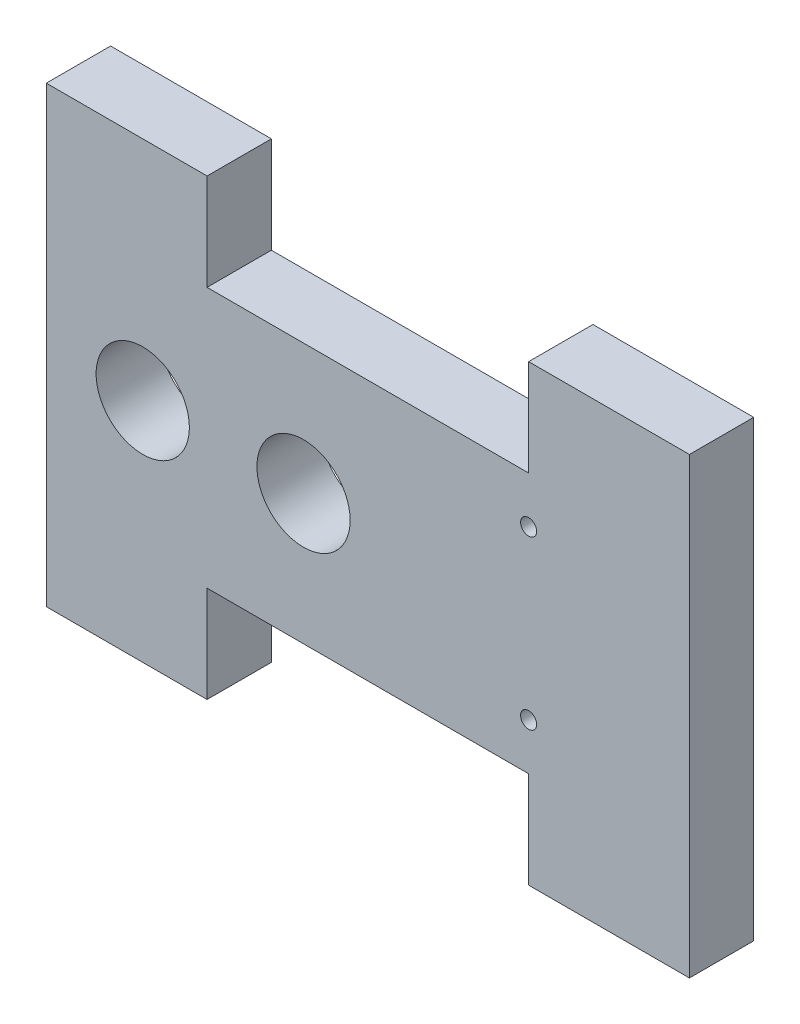
ISO-10303-21;
HEADER;
FILE_DESCRIPTION(('STEP AP214'),'2;1');
FILE_NAME('part.step','',(''),(''),'','','');
FILE_SCHEMA(('AUTOMOTIVE_DESIGN { 1 0 10303 214 1 1 1 1 }'));
ENDSEC;
DATA;
#1=APPLICATION_CONTEXT('core data for automotive mechanical design processes');
#2=APPLICATION_PROTOCOL_DEFINITION('international standard','automotive_design',2000,#1);
#3=PRODUCT_CONTEXT('',#1,'mechanical');
#4=PRODUCT('Part','Part','',(#3));
#5=PRODUCT_RELATED_PRODUCT_CATEGORY('part','',(#4));
#6=PRODUCT_DEFINITION_FORMATION('','',#4);
#7=PRODUCT_DEFINITION_CONTEXT('part definition',#1,'design');
#8=PRODUCT_DEFINITION('design','',#6,#7);
#9=PRODUCT_DEFINITION_SHAPE('','',#8);
#10=(LENGTH_UNIT() NAMED_UNIT(*) SI_UNIT(.MILLI.,.METRE.));
#11=(NAMED_UNIT(*) PLANE_ANGLE_UNIT() SI_UNIT($,.RADIAN.));
#12=(NAMED_UNIT(*) SI_UNIT($,.STERADIAN.) SOLID_ANGLE_UNIT());
#13=UNCERTAINTY_MEASURE_WITH_UNIT(LENGTH_MEASURE(1.E-05),#10,'distance_accuracy_value','');
#14=(GEOMETRIC_REPRESENTATION_CONTEXT(3) GLOBAL_UNCERTAINTY_ASSIGNED_CONTEXT((#13)) GLOBAL_UNIT_ASSIGNED_CONTEXT((#10,
#11,#12)) REPRESENTATION_CONTEXT('',''));
#15=CARTESIAN_POINT('',(0.,0.,0.));
#16=DIRECTION('',(0.,0.,1.));
#17=DIRECTION('',(1.,0.,0.));
#18=AXIS2_PLACEMENT_3D('',#15,#16,#17);
#19=CARTESIAN_POINT('',(-93.3490832191863,6.09260289357956,1.7));
#20=DIRECTION('',(-1.,0.,0.));
#21=DIRECTION('',(0.,0.,1.));
#22=AXIS2_PLACEMENT_3D('',#19,#20,#21);
#23=PLANE('',#22);
#24=DIRECTION('',(0.,0.,-1.));
#25=VECTOR('',#24,1.);
#26=CARTESIAN_POINT('',(-93.3490832191863,6.09260289357956,1.7));
#27=LINE('',#26,#25);
#28=CARTESIAN_POINT('',(-93.3490832191863,6.09260289357956,1.7));
#29=VERTEX_POINT('',#28);
#30=CARTESIAN_POINT('',(-93.3490832191863,6.09260289357956,-0.3));
#31=VERTEX_POINT('',#30);
#32=EDGE_CURVE('E141',#29,#31,#27,.T.);
#33=ORIENTED_EDGE('',*,*,#32,.T.);
#34=DIRECTION('',(0.,1.,0.));
#35=VECTOR('',#34,1.);
#36=CARTESIAN_POINT('',(-93.3490832191863,6.09260289357956,-0.3));
#37=LINE('',#36,#35);
#38=CARTESIAN_POINT('',(-93.3490832191863,9.09260289357956,-0.3));
#39=VERTEX_POINT('',#38);
#40=EDGE_CURVE('E135',#31,#39,#37,.T.);
#41=ORIENTED_EDGE('',*,*,#40,.T.);
#42=DIRECTION('',(0.,0.,-1.));
#43=VECTOR('',#42,1.);
#44=CARTESIAN_POINT('',(-93.3490832191863,9.09260289357956,1.7));
#45=LINE('',#44,#43);
#46=CARTESIAN_POINT('',(-93.3490832191863,9.09260289357956,1.7));
#47=VERTEX_POINT('',#46);
#48=EDGE_CURVE('E11',#47,#39,#45,.T.);
#49=ORIENTED_EDGE('',*,*,#48,.F.);
#50=DIRECTION('',(0.,1.,0.));
#51=VECTOR('',#50,1.);
#52=CARTESIAN_POINT('',(-93.3490832191863,6.09260289357956,1.7));
#53=LINE('',#52,#51);
#54=EDGE_CURVE('E176',#29,#47,#53,.T.);
#55=ORIENTED_EDGE('',*,*,#54,.F.);
#56=EDGE_LOOP('',(#33,#41,#49,#55));
#57=FACE_BOUND('',#56,.T.);
#58=ADVANCED_FACE('F35',(#57),#23,.F.);
#59=CARTESIAN_POINT('',(-93.3490832191863,9.09260289357956,1.7));
#60=DIRECTION('',(0.,1.,0.));
#61=DIRECTION('',(0.,0.,1.));
#62=AXIS2_PLACEMENT_3D('',#59,#60,#61);
#63=PLANE('',#62);
#64=ORIENTED_EDGE('',*,*,#48,.T.);
#65=DIRECTION('',(1.,0.,0.));
#66=VECTOR('',#65,1.);
#67=CARTESIAN_POINT('',(-93.3490832191863,9.09260289357956,-0.3));
#68=LINE('',#67,#66);
#69=CARTESIAN_POINT('',(-83.3490832191863,9.09260289357956,-0.3));
#70=VERTEX_POINT('',#69);
#71=EDGE_CURVE('E125',#39,#70,#68,.T.);
#72=ORIENTED_EDGE('',*,*,#71,.T.);
#73=DIRECTION('',(0.,0.,-1.));
#74=VECTOR('',#73,1.);
#75=CARTESIAN_POINT('',(-83.3490832191863,9.09260289357956,1.7));
#76=LINE('',#75,#74);
#77=CARTESIAN_POINT('',(-83.3490832191863,9.09260289357956,1.7));
#78=VERTEX_POINT('',#77);
#79=EDGE_CURVE('E42',#78,#70,#76,.T.);
#80=ORIENTED_EDGE('',*,*,#79,.F.);
#81=DIRECTION('',(1.,0.,0.));
#82=VECTOR('',#81,1.);
#83=CARTESIAN_POINT('',(-93.3490832191863,9.09260289357956,1.7));
#84=LINE('',#83,#82);
#85=EDGE_CURVE('E126',#47,#78,#84,.T.);
#86=ORIENTED_EDGE('',*,*,#85,.F.);
#87=EDGE_LOOP('',(#64,#72,#80,#86));
#88=FACE_BOUND('',#87,.T.);
#89=ADVANCED_FACE('F123',(#88),#63,.F.);
#90=CARTESIAN_POINT('',(-83.3490832191863,6.09260289357956,1.7));
#91=DIRECTION('',(1.,0.,0.));
#92=DIRECTION('',(0.,0.,-1.));
#93=AXIS2_PLACEMENT_3D('',#90,#91,#92);
#94=PLANE('',#93);
#95=ORIENTED_EDGE('',*,*,#79,.T.);
#96=DIRECTION('',(0.,-1.,0.));
#97=VECTOR('',#96,1.);
#98=CARTESIAN_POINT('',(-83.3490832191863,6.09260289357956,-0.3));
#99=LINE('',#98,#97);
#100=CARTESIAN_POINT('',(-83.3490832191863,6.09260289357956,-0.3));
#101=VERTEX_POINT('',#100);
#102=EDGE_CURVE('E139',#70,#101,#99,.T.);
#103=ORIENTED_EDGE('',*,*,#102,.T.);
#104=DIRECTION('',(0.,0.,-1.));
#105=VECTOR('',#104,1.);
#106=CARTESIAN_POINT('',(-83.3490832191863,6.09260289357956,1.7));
#107=LINE('',#106,#105);
#108=CARTESIAN_POINT('',(-83.3490832191863,6.09260289357956,1.7));
#109=VERTEX_POINT('',#108);
#110=EDGE_CURVE('E214',#109,#101,#107,.T.);
#111=ORIENTED_EDGE('',*,*,#110,.F.);
#112=DIRECTION('',(0.,-1.,0.));
#113=VECTOR('',#112,1.);
#114=CARTESIAN_POINT('',(-83.3490832191863,6.09260289357956,1.7));
#115=LINE('',#114,#113);
#116=EDGE_CURVE('E179',#78,#109,#115,.T.);
#117=ORIENTED_EDGE('',*,*,#116,.F.);
#118=EDGE_LOOP('',(#95,#103,#111,#117));
#119=FACE_BOUND('',#118,.T.);
#120=ADVANCED_FACE('F217',(#119),#94,.F.);
#121=CARTESIAN_POINT('',(-78.3490832191863,6.09260289357956,1.7));
#122=DIRECTION('',(0.,1.,0.));
#123=DIRECTION('',(-1.,0.,0.));
#124=AXIS2_PLACEMENT_3D('',#121,#122,#123);
#125=PLANE('',#124);
#126=ORIENTED_EDGE('',*,*,#110,.T.);
#127=DIRECTION('',(1.,0.,0.));
#128=VECTOR('',#127,1.);
#129=CARTESIAN_POINT('',(-78.3490832191863,6.09260289357956,-0.3));
#130=LINE('',#129,#128);
#131=CARTESIAN_POINT('',(-78.3490832191863,6.09260289357956,-0.3));
#132=VERTEX_POINT('',#131);
#133=EDGE_CURVE('E150',#101,#132,#130,.T.);
#134=ORIENTED_EDGE('',*,*,#133,.T.);
#135=DIRECTION('',(0.,0.,-1.));
#136=VECTOR('',#135,1.);
#137=CARTESIAN_POINT('',(-78.3490832191863,6.09260289357956,1.7));
#138=LINE('',#137,#136);
#139=CARTESIAN_POINT('',(-78.3490832191863,6.09260289357956,1.7));
#140=VERTEX_POINT('',#139);
#141=EDGE_CURVE('E212',#140,#132,#138,.T.);
#142=ORIENTED_EDGE('',*,*,#141,.F.);
#143=DIRECTION('',(1.,0.,0.));
#144=VECTOR('',#143,1.);
#145=CARTESIAN_POINT('',(-78.3490832191863,6.09260289357956,1.7));
#146=LINE('',#145,#144);
#147=EDGE_CURVE('E181',#109,#140,#146,.T.);
#148=ORIENTED_EDGE('',*,*,#147,.F.);
#149=EDGE_LOOP('',(#126,#134,#142,#148));
#150=FACE_BOUND('',#149,.T.);
#151=ADVANCED_FACE('F225',(#150),#125,.F.);
#152=CARTESIAN_POINT('',(-78.3490832191863,20.1926028935796,1.7));
#153=DIRECTION('',(-1.,0.,0.));
#154=DIRECTION('',(0.,0.,1.));
#155=AXIS2_PLACEMENT_3D('',#152,#153,#154);
#156=PLANE('',#155);
#157=ORIENTED_EDGE('',*,*,#141,.T.);
#158=DIRECTION('',(0.,1.,0.));
#159=VECTOR('',#158,1.);
#160=CARTESIAN_POINT('',(-78.3490832191863,20.1926028935796,-0.3));
#161=LINE('',#160,#159);
#162=CARTESIAN_POINT('',(-78.3490832191863,20.1926028935796,-0.3));
#163=VERTEX_POINT('',#162);
#164=EDGE_CURVE('E153',#132,#163,#161,.T.);
#165=ORIENTED_EDGE('',*,*,#164,.T.);
#166=DIRECTION('',(0.,0.,-1.));
#167=VECTOR('',#166,1.);
#168=CARTESIAN_POINT('',(-78.3490832191863,20.1926028935796,1.7));
#169=LINE('',#168,#167);
#170=CARTESIAN_POINT('',(-78.3490832191863,20.1926028935796,1.7));
#171=VERTEX_POINT('',#170);
#172=EDGE_CURVE('E210',#171,#163,#169,.T.);
#173=ORIENTED_EDGE('',*,*,#172,.F.);
#174=DIRECTION('',(0.,1.,0.));
#175=VECTOR('',#174,1.);
#176=CARTESIAN_POINT('',(-78.3490832191863,20.1926028935796,1.7));
#177=LINE('',#176,#175);
#178=EDGE_CURVE('E183',#140,#171,#177,.T.);
#179=ORIENTED_EDGE('',*,*,#178,.F.);
#180=EDGE_LOOP('',(#157,#165,#173,#179));
#181=FACE_BOUND('',#180,.T.);
#182=ADVANCED_FACE('F228',(#181),#156,.F.);
#183=CARTESIAN_POINT('',(-78.3490832191863,20.1926028935796,1.7));
#184=DIRECTION('',(0.,-1.,0.));
#185=DIRECTION('',(0.,0.,-1.));
#186=AXIS2_PLACEMENT_3D('',#183,#184,#185);
#187=PLANE('',#186);
#188=ORIENTED_EDGE('',*,*,#172,.T.);
#189=DIRECTION('',(-1.,0.,0.));
#190=VECTOR('',#189,1.);
#191=CARTESIAN_POINT('',(-78.3490832191863,20.1926028935796,-0.3));
#192=LINE('',#191,#190);
#193=CARTESIAN_POINT('',(-83.3490832191863,20.1926028935796,-0.3));
#194=VERTEX_POINT('',#193);
#195=EDGE_CURVE('E156',#163,#194,#192,.T.);
#196=ORIENTED_EDGE('',*,*,#195,.T.);
#197=DIRECTION('',(0.,0.,-1.));
#198=VECTOR('',#197,1.);
#199=CARTESIAN_POINT('',(-83.3490832191863,20.1926028935796,1.7));
#200=LINE('',#199,#198);
#201=CARTESIAN_POINT('',(-83.3490832191863,20.1926028935796,1.7));
#202=VERTEX_POINT('',#201);
#203=EDGE_CURVE('E208',#202,#194,#200,.T.);
#204=ORIENTED_EDGE('',*,*,#203,.F.);
#205=DIRECTION('',(-1.,0.,0.));
#206=VECTOR('',#205,1.);
#207=CARTESIAN_POINT('',(-78.3490832191863,20.1926028935796,1.7));
#208=LINE('',#207,#206);
#209=EDGE_CURVE('E185',#171,#202,#208,.T.);
#210=ORIENTED_EDGE('',*,*,#209,.F.);
#211=EDGE_LOOP('',(#188,#196,#204,#210));
#212=FACE_BOUND('',#211,.T.);
#213=ADVANCED_FACE('F233',(#212),#187,.F.);
#214=CARTESIAN_POINT('',(-83.3490832191863,20.1926028935796,1.7));
#215=DIRECTION('',(1.,0.,0.));
#216=DIRECTION('',(0.,0.,-1.));
#217=AXIS2_PLACEMENT_3D('',#214,#215,#216);
#218=PLANE('',#217);
#219=ORIENTED_EDGE('',*,*,#203,.T.);
#220=DIRECTION('',(0.,-1.,0.));
#221=VECTOR('',#220,1.);
#222=CARTESIAN_POINT('',(-83.3490832191863,20.1926028935796,-0.3));
#223=LINE('',#222,#221);
#224=CARTESIAN_POINT('',(-83.3490832191863,17.1926028935796,-0.3));
#225=VERTEX_POINT('',#224);
#226=EDGE_CURVE('E159',#194,#225,#223,.T.);
#227=ORIENTED_EDGE('',*,*,#226,.T.);
#228=DIRECTION('',(0.,0.,-1.));
#229=VECTOR('',#228,1.);
#230=CARTESIAN_POINT('',(-83.3490832191863,17.1926028935796,1.7));
#231=LINE('',#230,#229);
#232=CARTESIAN_POINT('',(-83.3490832191863,17.1926028935796,1.7));
#233=VERTEX_POINT('',#232);
#234=EDGE_CURVE('E206',#233,#225,#231,.T.);
#235=ORIENTED_EDGE('',*,*,#234,.F.);
#236=DIRECTION('',(0.,-1.,0.));
#237=VECTOR('',#236,1.);
#238=CARTESIAN_POINT('',(-83.3490832191863,20.1926028935796,1.7));
#239=LINE('',#238,#237);
#240=EDGE_CURVE('E187',#202,#233,#239,.T.);
#241=ORIENTED_EDGE('',*,*,#240,.F.);
#242=EDGE_LOOP('',(#219,#227,#235,#241));
#243=FACE_BOUND('',#242,.T.);
#244=ADVANCED_FACE('F239',(#243),#218,.F.);
#245=CARTESIAN_POINT('',(-93.3490832191863,17.1926028935796,1.7));
#246=DIRECTION('',(0.,-1.,0.));
#247=DIRECTION('',(0.,0.,-1.));
#248=AXIS2_PLACEMENT_3D('',#245,#246,#247);
#249=PLANE('',#248);
#250=ORIENTED_EDGE('',*,*,#234,.T.);
#251=DIRECTION('',(-1.,0.,0.));
#252=VECTOR('',#251,1.);
#253=CARTESIAN_POINT('',(-93.3490832191863,17.1926028935796,-0.3));
#254=LINE('',#253,#252);
#255=CARTESIAN_POINT('',(-93.3490832191863,17.1926028935796,-0.3));
#256=VERTEX_POINT('',#255);
#257=EDGE_CURVE('E162',#225,#256,#254,.T.);
#258=ORIENTED_EDGE('',*,*,#257,.T.);
#259=DIRECTION('',(0.,0.,-1.));
#260=VECTOR('',#259,1.);
#261=CARTESIAN_POINT('',(-93.3490832191863,17.1926028935796,1.7));
#262=LINE('',#261,#260);
#263=CARTESIAN_POINT('',(-93.3490832191863,17.1926028935796,1.7));
#264=VERTEX_POINT('',#263);
#265=EDGE_CURVE('E204',#264,#256,#262,.T.);
#266=ORIENTED_EDGE('',*,*,#265,.F.);
#267=DIRECTION('',(-1.,0.,0.));
#268=VECTOR('',#267,1.);
#269=CARTESIAN_POINT('',(-93.3490832191863,17.1926028935796,1.7));
#270=LINE('',#269,#268);
#271=EDGE_CURVE('E189',#233,#264,#270,.T.);
#272=ORIENTED_EDGE('',*,*,#271,.F.);
#273=EDGE_LOOP('',(#250,#258,#266,#272));
#274=FACE_BOUND('',#273,.T.);
#275=ADVANCED_FACE('F243',(#274),#249,.F.);
#276=CARTESIAN_POINT('',(-93.3490832191863,20.1926028935796,1.7));
#277=DIRECTION('',(-1.,0.,0.));
#278=DIRECTION('',(0.,0.,1.));
#279=AXIS2_PLACEMENT_3D('',#276,#277,#278);
#280=PLANE('',#279);
#281=ORIENTED_EDGE('',*,*,#265,.T.);
#282=DIRECTION('',(0.,1.,0.));
#283=VECTOR('',#282,1.);
#284=CARTESIAN_POINT('',(-93.3490832191863,20.1926028935796,-0.3));
#285=LINE('',#284,#283);
#286=CARTESIAN_POINT('',(-93.3490832191863,20.1926028935796,-0.3));
#287=VERTEX_POINT('',#286);
#288=EDGE_CURVE('E165',#256,#287,#285,.T.);
#289=ORIENTED_EDGE('',*,*,#288,.T.);
#290=DIRECTION('',(0.,0.,-1.));
#291=VECTOR('',#290,1.);
#292=CARTESIAN_POINT('',(-93.3490832191863,20.1926028935796,1.7));
#293=LINE('',#292,#291);
#294=CARTESIAN_POINT('',(-93.3490832191863,20.1926028935796,1.7));
#295=VERTEX_POINT('',#294);
#296=EDGE_CURVE('E202',#295,#287,#293,.T.);
#297=ORIENTED_EDGE('',*,*,#296,.F.);
#298=DIRECTION('',(0.,1.,0.));
#299=VECTOR('',#298,1.);
#300=CARTESIAN_POINT('',(-93.3490832191863,20.1926028935796,1.7));
#301=LINE('',#300,#299);
#302=EDGE_CURVE('E191',#264,#295,#301,.T.);
#303=ORIENTED_EDGE('',*,*,#302,.F.);
#304=EDGE_LOOP('',(#281,#289,#297,#303));
#305=FACE_BOUND('',#304,.T.);
#306=ADVANCED_FACE('F248',(#305),#280,.F.);
#307=CARTESIAN_POINT('',(-98.3490832191863,20.1926028935796,1.7));
#308=DIRECTION('',(0.,-1.,0.));
#309=DIRECTION('',(0.,0.,-1.));
#310=AXIS2_PLACEMENT_3D('',#307,#308,#309);
#311=PLANE('',#310);
#312=ORIENTED_EDGE('',*,*,#296,.T.);
#313=DIRECTION('',(-1.,0.,0.));
#314=VECTOR('',#313,1.);
#315=CARTESIAN_POINT('',(-98.3490832191863,20.1926028935796,-0.3));
#316=LINE('',#315,#314);
#317=CARTESIAN_POINT('',(-98.3490832191863,20.1926028935796,-0.3));
#318=VERTEX_POINT('',#317);
#319=EDGE_CURVE('E168',#287,#318,#316,.T.);
#320=ORIENTED_EDGE('',*,*,#319,.T.);
#321=DIRECTION('',(0.,0.,-1.));
#322=VECTOR('',#321,1.);
#323=CARTESIAN_POINT('',(-98.3490832191863,20.1926028935796,1.7));
#324=LINE('',#323,#322);
#325=CARTESIAN_POINT('',(-98.3490832191863,20.1926028935796,1.7));
#326=VERTEX_POINT('',#325);
#327=EDGE_CURVE('E200',#326,#318,#324,.T.);
#328=ORIENTED_EDGE('',*,*,#327,.F.);
#329=DIRECTION('',(-1.,0.,0.));
#330=VECTOR('',#329,1.);
#331=CARTESIAN_POINT('',(-98.3490832191863,20.1926028935796,1.7));
#332=LINE('',#331,#330);
#333=EDGE_CURVE('E193',#295,#326,#332,.T.);
#334=ORIENTED_EDGE('',*,*,#333,.F.);
#335=EDGE_LOOP('',(#312,#320,#328,#334));
#336=FACE_BOUND('',#335,.T.);
#337=ADVANCED_FACE('F252',(#336),#311,.F.);
#338=CARTESIAN_POINT('',(-98.3490832191863,20.1926028935796,1.7));
#339=DIRECTION('',(1.,0.,0.));
#340=DIRECTION('',(0.,0.,-1.));
#341=AXIS2_PLACEMENT_3D('',#338,#339,#340);
#342=PLANE('',#341);
#343=ORIENTED_EDGE('',*,*,#327,.T.);
#344=DIRECTION('',(0.,-1.,0.));
#345=VECTOR('',#344,1.);
#346=CARTESIAN_POINT('',(-98.3490832191863,20.1926028935796,-0.3));
#347=LINE('',#346,#345);
#348=CARTESIAN_POINT('',(-98.3490832191863,6.09260289357956,-0.3));
#349=VERTEX_POINT('',#348);
#350=EDGE_CURVE('E171',#318,#349,#347,.T.);
#351=ORIENTED_EDGE('',*,*,#350,.T.);
#352=DIRECTION('',(0.,0.,-1.));
#353=VECTOR('',#352,1.);
#354=CARTESIAN_POINT('',(-98.3490832191863,6.09260289357956,1.7));
#355=LINE('',#354,#353);
#356=CARTESIAN_POINT('',(-98.3490832191863,6.09260289357956,1.7));
#357=VERTEX_POINT('',#356);
#358=EDGE_CURVE('E198',#357,#349,#355,.T.);
#359=ORIENTED_EDGE('',*,*,#358,.F.);
#360=DIRECTION('',(0.,-1.,0.));
#361=VECTOR('',#360,1.);
#362=CARTESIAN_POINT('',(-98.3490832191863,20.1926028935796,1.7));
#363=LINE('',#362,#361);
#364=EDGE_CURVE('E54',#326,#357,#363,.T.);
#365=ORIENTED_EDGE('',*,*,#364,.F.);
#366=EDGE_LOOP('',(#343,#351,#359,#365));
#367=FACE_BOUND('',#366,.T.);
#368=ADVANCED_FACE('F256',(#367),#342,.F.);
#369=CARTESIAN_POINT('',(-98.3490832191863,6.09260289357956,1.7));
#370=DIRECTION('',(0.,1.,0.));
#371=DIRECTION('',(0.,0.,1.));
#372=AXIS2_PLACEMENT_3D('',#369,#370,#371);
#373=PLANE('',#372);
#374=ORIENTED_EDGE('',*,*,#358,.T.);
#375=DIRECTION('',(1.,0.,0.));
#376=VECTOR('',#375,1.);
#377=CARTESIAN_POINT('',(-98.3490832191863,6.09260289357956,-0.3));
#378=LINE('',#377,#376);
#379=EDGE_CURVE('E174',#349,#31,#378,.T.);
#380=ORIENTED_EDGE('',*,*,#379,.T.);
#381=ORIENTED_EDGE('',*,*,#32,.F.);
#382=DIRECTION('',(1.,0.,0.));
#383=VECTOR('',#382,1.);
#384=CARTESIAN_POINT('',(-98.3490832191863,6.09260289357956,1.7));
#385=LINE('',#384,#383);
#386=EDGE_CURVE('E49',#357,#29,#385,.T.);
#387=ORIENTED_EDGE('',*,*,#386,.F.);
#388=EDGE_LOOP('',(#374,#380,#381,#387));
#389=FACE_BOUND('',#388,.T.);
#390=ADVANCED_FACE('F258',(#389),#373,.F.);
#391=CARTESIAN_POINT('',(0.,0.,1.7));
#392=DIRECTION('',(0.,0.,-1.));
#393=DIRECTION('',(-1.,0.,0.));
#394=AXIS2_PLACEMENT_3D('',#391,#392,#393);
#395=PLANE('',#394);
#396=CARTESIAN_POINT('',(-83.3490832191863,10.5426028935796,1.7));
#397=DIRECTION('',(0.,0.,1.));
#398=DIRECTION('',(1.,0.,0.));
#399=AXIS2_PLACEMENT_3D('',#396,#397,#398);
#400=CIRCLE('',#399,0.25);
#401=CARTESIAN_POINT('',(-83.0990832191863,10.5426028935796,1.7));
#402=VERTEX_POINT('',#401);
#403=EDGE_CURVE('E370',#402,#402,#400,.T.);
#404=ORIENTED_EDGE('',*,*,#403,.F.);
#405=EDGE_LOOP('',(#404));
#406=FACE_BOUND('',#405,.T.);
#407=CARTESIAN_POINT('',(-83.3490832191863,15.7426028935796,1.7));
#408=DIRECTION('',(0.,0.,1.));
#409=DIRECTION('',(1.,0.,0.));
#410=AXIS2_PLACEMENT_3D('',#407,#408,#409);
#411=CIRCLE('',#410,0.25);
#412=CARTESIAN_POINT('',(-83.0990832191863,15.7426028935796,1.7));
#413=VERTEX_POINT('',#412);
#414=EDGE_CURVE('E372',#413,#413,#411,.T.);
#415=ORIENTED_EDGE('',*,*,#414,.F.);
#416=EDGE_LOOP('',(#415));
#417=FACE_BOUND('',#416,.T.);
#418=CARTESIAN_POINT('',(-90.3490832191863,13.1426028935796,1.7));
#419=DIRECTION('',(0.,0.,1.));
#420=DIRECTION('',(1.,0.,0.));
#421=AXIS2_PLACEMENT_3D('',#418,#419,#420);
#422=CIRCLE('',#421,1.45);
#423=CARTESIAN_POINT('',(-88.8990832191863,13.1426028935796,1.7));
#424=VERTEX_POINT('',#423);
#425=EDGE_CURVE('E378',#424,#424,#422,.T.);
#426=ORIENTED_EDGE('',*,*,#425,.F.);
#427=EDGE_LOOP('',(#426));
#428=FACE_BOUND('',#427,.T.);
#429=CARTESIAN_POINT('',(-95.3490832191863,13.1426028935796,1.7));
#430=DIRECTION('',(0.,0.,1.));
#431=DIRECTION('',(1.,0.,0.));
#432=AXIS2_PLACEMENT_3D('',#429,#430,#431);
#433=CIRCLE('',#432,1.45);
#434=CARTESIAN_POINT('',(-93.8990832191863,13.1426028935796,1.7));
#435=VERTEX_POINT('',#434);
#436=EDGE_CURVE('E145',#435,#435,#433,.T.);
#437=ORIENTED_EDGE('',*,*,#436,.F.);
#438=EDGE_LOOP('',(#437));
#439=FACE_BOUND('',#438,.T.);
#440=ORIENTED_EDGE('',*,*,#54,.T.);
#441=ORIENTED_EDGE('',*,*,#85,.T.);
#442=ORIENTED_EDGE('',*,*,#116,.T.);
#443=ORIENTED_EDGE('',*,*,#147,.T.);
#444=ORIENTED_EDGE('',*,*,#178,.T.);
#445=ORIENTED_EDGE('',*,*,#209,.T.);
#446=ORIENTED_EDGE('',*,*,#240,.T.);
#447=ORIENTED_EDGE('',*,*,#271,.T.);
#448=ORIENTED_EDGE('',*,*,#302,.T.);
#449=ORIENTED_EDGE('',*,*,#333,.T.);
#450=ORIENTED_EDGE('',*,*,#364,.T.);
#451=ORIENTED_EDGE('',*,*,#386,.T.);
#452=EDGE_LOOP('',(#440,#441,#442,#443,#444,#445,#446,#447,#448,#449,#450,#451));
#453=FACE_BOUND('',#452,.T.);
#454=ADVANCED_FACE('F220',(#406,#417,#428,#439,#453),#395,.F.);
#455=CARTESIAN_POINT('',(0.,0.,-0.3));
#456=DIRECTION('',(0.,0.,-1.));
#457=DIRECTION('',(-1.,0.,0.));
#458=AXIS2_PLACEMENT_3D('',#455,#456,#457);
#459=PLANE('',#458);
#460=CARTESIAN_POINT('',(-83.3490832191863,10.5426028935796,-0.3));
#461=DIRECTION('',(0.,0.,1.));
#462=DIRECTION('',(1.,0.,0.));
#463=AXIS2_PLACEMENT_3D('',#460,#461,#462);
#464=CIRCLE('',#463,0.25);
#465=CARTESIAN_POINT('',(-83.0990832191863,10.5426028935796,-0.3));
#466=VERTEX_POINT('',#465);
#467=EDGE_CURVE('E367',#466,#466,#464,.T.);
#468=ORIENTED_EDGE('',*,*,#467,.T.);
#469=EDGE_LOOP('',(#468));
#470=FACE_BOUND('',#469,.T.);
#471=CARTESIAN_POINT('',(-83.3490832191863,15.7426028935796,-0.3));
#472=DIRECTION('',(0.,0.,1.));
#473=DIRECTION('',(1.,0.,0.));
#474=AXIS2_PLACEMENT_3D('',#471,#472,#473);
#475=CIRCLE('',#474,0.25);
#476=CARTESIAN_POINT('',(-83.0990832191863,15.7426028935796,-0.3));
#477=VERTEX_POINT('',#476);
#478=EDGE_CURVE('E375',#477,#477,#475,.T.);
#479=ORIENTED_EDGE('',*,*,#478,.T.);
#480=EDGE_LOOP('',(#479));
#481=FACE_BOUND('',#480,.T.);
#482=CARTESIAN_POINT('',(-90.3490832191863,13.1426028935796,-0.3));
#483=DIRECTION('',(0.,0.,1.));
#484=DIRECTION('',(1.,0.,0.));
#485=AXIS2_PLACEMENT_3D('',#482,#483,#484);
#486=CIRCLE('',#485,1.45);
#487=CARTESIAN_POINT('',(-88.8990832191863,13.1426028935796,-0.3));
#488=VERTEX_POINT('',#487);
#489=EDGE_CURVE('E381',#488,#488,#486,.T.);
#490=ORIENTED_EDGE('',*,*,#489,.T.);
#491=EDGE_LOOP('',(#490));
#492=FACE_BOUND('',#491,.T.);
#493=CARTESIAN_POINT('',(-95.3490832191863,13.1426028935796,-0.3));
#494=DIRECTION('',(0.,0.,1.));
#495=DIRECTION('',(1.,0.,0.));
#496=AXIS2_PLACEMENT_3D('',#493,#494,#495);
#497=CIRCLE('',#496,1.45);
#498=CARTESIAN_POINT('',(-93.8990832191863,13.1426028935796,-0.3));
#499=VERTEX_POINT('',#498);
#500=EDGE_CURVE('E142',#499,#499,#497,.T.);
#501=ORIENTED_EDGE('',*,*,#500,.T.);
#502=EDGE_LOOP('',(#501));
#503=FACE_BOUND('',#502,.T.);
#504=ORIENTED_EDGE('',*,*,#40,.F.);
#505=ORIENTED_EDGE('',*,*,#379,.F.);
#506=ORIENTED_EDGE('',*,*,#350,.F.);
#507=ORIENTED_EDGE('',*,*,#319,.F.);
#508=ORIENTED_EDGE('',*,*,#288,.F.);
#509=ORIENTED_EDGE('',*,*,#257,.F.);
#510=ORIENTED_EDGE('',*,*,#226,.F.);
#511=ORIENTED_EDGE('',*,*,#195,.F.);
#512=ORIENTED_EDGE('',*,*,#164,.F.);
#513=ORIENTED_EDGE('',*,*,#133,.F.);
#514=ORIENTED_EDGE('',*,*,#102,.F.);
#515=ORIENTED_EDGE('',*,*,#71,.F.);
#516=EDGE_LOOP('',(#504,#505,#506,#507,#508,#509,#510,#511,#512,#513,#514,#515));
#517=FACE_BOUND('',#516,.T.);
#518=ADVANCED_FACE('F133',(#470,#481,#492,#503,#517),#459,.T.);
#519=CARTESIAN_POINT('',(-95.3490832191863,13.1426028935796,-0.3));
#520=DIRECTION('',(0.,0.,1.));
#521=DIRECTION('',(1.,0.,0.));
#522=AXIS2_PLACEMENT_3D('',#519,#520,#521);
#523=CYLINDRICAL_SURFACE('',#522,1.45);
#524=ORIENTED_EDGE('',*,*,#500,.F.);
#525=EDGE_LOOP('',(#524));
#526=FACE_BOUND('',#525,.T.);
#527=ORIENTED_EDGE('',*,*,#436,.T.);
#528=EDGE_LOOP('',(#527));
#529=FACE_BOUND('',#528,.T.);
#530=ADVANCED_FACE('F310',(#526,#529),#523,.F.);
#531=CARTESIAN_POINT('',(-90.3490832191863,13.1426028935796,-0.3));
#532=DIRECTION('',(0.,0.,1.));
#533=DIRECTION('',(1.,0.,0.));
#534=AXIS2_PLACEMENT_3D('',#531,#532,#533);
#535=CYLINDRICAL_SURFACE('',#534,1.45);
#536=ORIENTED_EDGE('',*,*,#489,.F.);
#537=EDGE_LOOP('',(#536));
#538=FACE_BOUND('',#537,.T.);
#539=ORIENTED_EDGE('',*,*,#425,.T.);
#540=EDGE_LOOP('',(#539));
#541=FACE_BOUND('',#540,.T.);
#542=ADVANCED_FACE('F315',(#538,#541),#535,.F.);
#543=CARTESIAN_POINT('',(-83.3490832191863,15.7426028935796,-0.3));
#544=DIRECTION('',(0.,0.,1.));
#545=DIRECTION('',(1.,0.,0.));
#546=AXIS2_PLACEMENT_3D('',#543,#544,#545);
#547=CYLINDRICAL_SURFACE('',#546,0.25);
#548=ORIENTED_EDGE('',*,*,#478,.F.);
#549=EDGE_LOOP('',(#548));
#550=FACE_BOUND('',#549,.T.);
#551=ORIENTED_EDGE('',*,*,#414,.T.);
#552=EDGE_LOOP('',(#551));
#553=FACE_BOUND('',#552,.T.);
#554=ADVANCED_FACE('F326',(#550,#553),#547,.F.);
#555=CARTESIAN_POINT('',(-83.3490832191863,10.5426028935796,-0.3));
#556=DIRECTION('',(0.,0.,1.));
#557=DIRECTION('',(1.,0.,0.));
#558=AXIS2_PLACEMENT_3D('',#555,#556,#557);
#559=CYLINDRICAL_SURFACE('',#558,0.25);
#560=ORIENTED_EDGE('',*,*,#467,.F.);
#561=EDGE_LOOP('',(#560));
#562=FACE_BOUND('',#561,.T.);
#563=ORIENTED_EDGE('',*,*,#403,.T.);
#564=EDGE_LOOP('',(#563));
#565=FACE_BOUND('',#564,.T.);
#566=ADVANCED_FACE('F336',(#562,#565),#559,.F.);
#567=CLOSED_SHELL('',(#58,#89,#120,#151,#182,#213,#244,#275,#306,#337,#368,#390,#454,#518,#530,
#542,#554,#566));
#568=MANIFOLD_SOLID_BREP('B2',#567);
#569=ADVANCED_BREP_SHAPE_REPRESENTATION('',(#18,#568),#14);
#570=SHAPE_DEFINITION_REPRESENTATION(#9,#569);
ENDSEC;
END-ISO-10303-21;
